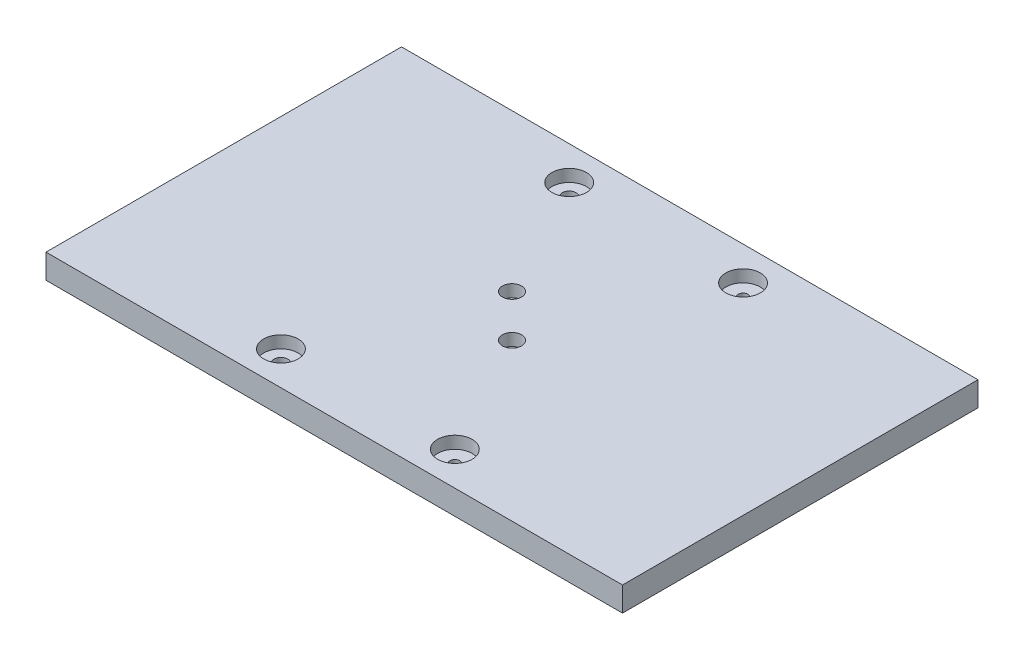
ISO-10303-21;
HEADER;
FILE_DESCRIPTION(('STEP AP214'),'2;1');
FILE_NAME('part.step','',(''),(''),'','','');
FILE_SCHEMA(('AUTOMOTIVE_DESIGN { 1 0 10303 214 1 1 1 1 }'));
ENDSEC;
DATA;
#1=APPLICATION_CONTEXT('core data for automotive mechanical design processes');
#2=APPLICATION_PROTOCOL_DEFINITION('international standard','automotive_design',2000,#1);
#3=PRODUCT_CONTEXT('',#1,'mechanical');
#4=PRODUCT('Part','Part','',(#3));
#5=PRODUCT_RELATED_PRODUCT_CATEGORY('part','',(#4));
#6=PRODUCT_DEFINITION_FORMATION('','',#4);
#7=PRODUCT_DEFINITION_CONTEXT('part definition',#1,'design');
#8=PRODUCT_DEFINITION('design','',#6,#7);
#9=PRODUCT_DEFINITION_SHAPE('','',#8);
#10=(LENGTH_UNIT() NAMED_UNIT(*) SI_UNIT(.MILLI.,.METRE.));
#11=(NAMED_UNIT(*) PLANE_ANGLE_UNIT() SI_UNIT($,.RADIAN.));
#12=(NAMED_UNIT(*) SI_UNIT($,.STERADIAN.) SOLID_ANGLE_UNIT());
#13=UNCERTAINTY_MEASURE_WITH_UNIT(LENGTH_MEASURE(1.E-05),#10,'distance_accuracy_value','');
#14=(GEOMETRIC_REPRESENTATION_CONTEXT(3) GLOBAL_UNCERTAINTY_ASSIGNED_CONTEXT((#13)) GLOBAL_UNIT_ASSIGNED_CONTEXT((#10,
#11,#12)) REPRESENTATION_CONTEXT('',''));
#15=CARTESIAN_POINT('',(0.,0.,0.));
#16=DIRECTION('',(0.,0.,1.));
#17=DIRECTION('',(1.,0.,0.));
#18=AXIS2_PLACEMENT_3D('',#15,#16,#17);
#19=CARTESIAN_POINT('',(0.,12.7,0.));
#20=DIRECTION('',(0.,1.,0.));
#21=DIRECTION('',(0.,0.,1.));
#22=AXIS2_PLACEMENT_3D('',#19,#20,#21);
#23=PLANE('',#22);
#24=CARTESIAN_POINT('',(-45.25,12.7,75.));
#25=DIRECTION('',(0.,1.,0.));
#26=DIRECTION('',(0.,0.,1.));
#27=AXIS2_PLACEMENT_3D('',#24,#25,#26);
#28=CIRCLE('',#27,8.99999999999999);
#29=CARTESIAN_POINT('',(-45.25,12.7,84.));
#30=VERTEX_POINT('',#29);
#31=EDGE_CURVE('E131',#30,#30,#28,.F.);
#32=ORIENTED_EDGE('',*,*,#31,.T.);
#33=EDGE_LOOP('',(#32));
#34=FACE_BOUND('',#33,.T.);
#35=DIRECTION('',(0.,0.,1.));
#36=VECTOR('',#35,1.);
#37=CARTESIAN_POINT('',(-150.,12.7,92.5));
#38=LINE('',#37,#36);
#39=CARTESIAN_POINT('',(-150.,12.7,-92.5));
#40=VERTEX_POINT('',#39);
#41=CARTESIAN_POINT('',(-150.,12.7,92.5));
#42=VERTEX_POINT('',#41);
#43=EDGE_CURVE('E85',#40,#42,#38,.T.);
#44=ORIENTED_EDGE('',*,*,#43,.T.);
#45=DIRECTION('',(1.,0.,0.));
#46=VECTOR('',#45,1.);
#47=CARTESIAN_POINT('',(150.,12.7,92.5));
#48=LINE('',#47,#46);
#49=CARTESIAN_POINT('',(150.,12.7,92.5));
#50=VERTEX_POINT('',#49);
#51=EDGE_CURVE('E80',#42,#50,#48,.T.);
#52=ORIENTED_EDGE('',*,*,#51,.T.);
#53=DIRECTION('',(0.,0.,-1.));
#54=VECTOR('',#53,1.);
#55=CARTESIAN_POINT('',(150.,12.7,92.5));
#56=LINE('',#55,#54);
#57=CARTESIAN_POINT('',(150.,12.7,-92.5));
#58=VERTEX_POINT('',#57);
#59=EDGE_CURVE('E83',#50,#58,#56,.T.);
#60=ORIENTED_EDGE('',*,*,#59,.T.);
#61=DIRECTION('',(-1.,0.,0.));
#62=VECTOR('',#61,1.);
#63=CARTESIAN_POINT('',(150.,12.7,-92.5));
#64=LINE('',#63,#62);
#65=EDGE_CURVE('E50',#58,#40,#64,.T.);
#66=ORIENTED_EDGE('',*,*,#65,.T.);
#67=EDGE_LOOP('',(#44,#52,#60,#66));
#68=FACE_BOUND('',#67,.T.);
#69=CARTESIAN_POINT('',(45.25,12.7,-75.));
#70=DIRECTION('',(0.,1.,0.));
#71=DIRECTION('',(0.,0.,1.));
#72=AXIS2_PLACEMENT_3D('',#69,#70,#71);
#73=CIRCLE('',#72,9.00000000000001);
#74=CARTESIAN_POINT('',(45.25,12.7,-66.));
#75=VERTEX_POINT('',#74);
#76=EDGE_CURVE('E135',#75,#75,#73,.T.);
#77=ORIENTED_EDGE('',*,*,#76,.F.);
#78=EDGE_LOOP('',(#77));
#79=FACE_BOUND('',#78,.T.);
#80=CARTESIAN_POINT('',(-11.,12.7,-11.));
#81=DIRECTION('',(0.,1.,0.));
#82=DIRECTION('',(0.,0.,1.));
#83=AXIS2_PLACEMENT_3D('',#80,#81,#82);
#84=CIRCLE('',#83,5.);
#85=CARTESIAN_POINT('',(-11.,12.7,-6.));
#86=VERTEX_POINT('',#85);
#87=EDGE_CURVE('E146',#86,#86,#84,.T.);
#88=ORIENTED_EDGE('',*,*,#87,.F.);
#89=EDGE_LOOP('',(#88));
#90=FACE_BOUND('',#89,.T.);
#91=CARTESIAN_POINT('',(11.,12.7,11.));
#92=DIRECTION('',(0.,1.,0.));
#93=DIRECTION('',(0.,0.,1.));
#94=AXIS2_PLACEMENT_3D('',#91,#92,#93);
#95=CIRCLE('',#94,5.);
#96=CARTESIAN_POINT('',(11.,12.7,16.));
#97=VERTEX_POINT('',#96);
#98=EDGE_CURVE('E155',#97,#97,#95,.T.);
#99=ORIENTED_EDGE('',*,*,#98,.F.);
#100=EDGE_LOOP('',(#99));
#101=FACE_BOUND('',#100,.T.);
#102=CARTESIAN_POINT('',(-45.25,12.7,-75.));
#103=DIRECTION('',(0.,1.,0.));
#104=DIRECTION('',(0.,0.,1.));
#105=AXIS2_PLACEMENT_3D('',#102,#103,#104);
#106=CIRCLE('',#105,9.00000000000001);
#107=CARTESIAN_POINT('',(-45.25,12.7,-66.));
#108=VERTEX_POINT('',#107);
#109=EDGE_CURVE('E164',#108,#108,#106,.T.);
#110=ORIENTED_EDGE('',*,*,#109,.F.);
#111=EDGE_LOOP('',(#110));
#112=FACE_BOUND('',#111,.T.);
#113=CARTESIAN_POINT('',(45.25,12.7,75.));
#114=DIRECTION('',(0.,-1.,0.));
#115=DIRECTION('',(0.,0.,-1.));
#116=AXIS2_PLACEMENT_3D('',#113,#114,#115);
#117=CIRCLE('',#116,9.00000000000001);
#118=CARTESIAN_POINT('',(45.25,12.7,66.));
#119=VERTEX_POINT('',#118);
#120=EDGE_CURVE('E178',#119,#119,#117,.T.);
#121=ORIENTED_EDGE('',*,*,#120,.T.);
#122=EDGE_LOOP('',(#121));
#123=FACE_BOUND('',#122,.T.);
#124=ADVANCED_FACE('F32',(#34,#68,#79,#90,#101,#112,#123),#23,.T.);
#125=CARTESIAN_POINT('',(-45.25,12.7,-75.));
#126=DIRECTION('',(0.,-1.,0.));
#127=DIRECTION('',(0.,0.,-1.));
#128=AXIS2_PLACEMENT_3D('',#125,#126,#127);
#129=CYLINDRICAL_SURFACE('',#128,3.55999999999999);
#130=CARTESIAN_POINT('',(-45.25,0.,-75.));
#131=DIRECTION('',(0.,1.,0.));
#132=DIRECTION('',(0.,0.,1.));
#133=AXIS2_PLACEMENT_3D('',#130,#131,#132);
#134=CIRCLE('',#133,3.55999999999999);
#135=CARTESIAN_POINT('',(-45.25,0.,-71.44));
#136=VERTEX_POINT('',#135);
#137=EDGE_CURVE('E101',#136,#136,#134,.T.);
#138=ORIENTED_EDGE('',*,*,#137,.F.);
#139=EDGE_LOOP('',(#138));
#140=FACE_BOUND('',#139,.T.);
#141=CARTESIAN_POINT('',(-45.25,6.35,-75.));
#142=DIRECTION('',(0.,1.,0.));
#143=DIRECTION('',(0.,0.,1.));
#144=AXIS2_PLACEMENT_3D('',#141,#142,#143);
#145=CIRCLE('',#144,3.55999999999999);
#146=CARTESIAN_POINT('',(-45.25,6.35,-71.44));
#147=VERTEX_POINT('',#146);
#148=EDGE_CURVE('E167',#147,#147,#145,.F.);
#149=ORIENTED_EDGE('',*,*,#148,.F.);
#150=EDGE_LOOP('',(#149));
#151=FACE_BOUND('',#150,.T.);
#152=ADVANCED_FACE('F206',(#140,#151),#129,.F.);
#153=CARTESIAN_POINT('',(11.,12.7,11.));
#154=DIRECTION('',(0.,-1.,0.));
#155=DIRECTION('',(0.,0.,-1.));
#156=AXIS2_PLACEMENT_3D('',#153,#154,#155);
#157=CYLINDRICAL_SURFACE('',#156,2.5);
#158=CARTESIAN_POINT('',(11.,0.,11.));
#159=DIRECTION('',(0.,1.,0.));
#160=DIRECTION('',(0.,0.,1.));
#161=AXIS2_PLACEMENT_3D('',#158,#159,#160);
#162=CIRCLE('',#161,2.5);
#163=CARTESIAN_POINT('',(11.,0.,13.5));
#164=VERTEX_POINT('',#163);
#165=EDGE_CURVE('E127',#164,#164,#162,.T.);
#166=ORIENTED_EDGE('',*,*,#165,.F.);
#167=EDGE_LOOP('',(#166));
#168=FACE_BOUND('',#167,.T.);
#169=CARTESIAN_POINT('',(11.,6.35,11.));
#170=DIRECTION('',(0.,1.,0.));
#171=DIRECTION('',(0.,0.,1.));
#172=AXIS2_PLACEMENT_3D('',#169,#170,#171);
#173=CIRCLE('',#172,2.5);
#174=CARTESIAN_POINT('',(11.,6.35,13.5));
#175=VERTEX_POINT('',#174);
#176=EDGE_CURVE('E158',#175,#175,#173,.F.);
#177=ORIENTED_EDGE('',*,*,#176,.F.);
#178=EDGE_LOOP('',(#177));
#179=FACE_BOUND('',#178,.T.);
#180=ADVANCED_FACE('F202',(#168,#179),#157,.F.);
#181=CARTESIAN_POINT('',(-11.,12.7,-11.));
#182=DIRECTION('',(0.,-1.,0.));
#183=DIRECTION('',(0.,0.,-1.));
#184=AXIS2_PLACEMENT_3D('',#181,#182,#183);
#185=CYLINDRICAL_SURFACE('',#184,2.5);
#186=CARTESIAN_POINT('',(-11.,0.,-11.));
#187=DIRECTION('',(0.,1.,0.));
#188=DIRECTION('',(0.,0.,1.));
#189=AXIS2_PLACEMENT_3D('',#186,#187,#188);
#190=CIRCLE('',#189,2.5);
#191=CARTESIAN_POINT('',(-11.,0.,-8.5));
#192=VERTEX_POINT('',#191);
#193=EDGE_CURVE('E124',#192,#192,#190,.T.);
#194=ORIENTED_EDGE('',*,*,#193,.F.);
#195=EDGE_LOOP('',(#194));
#196=FACE_BOUND('',#195,.T.);
#197=CARTESIAN_POINT('',(-11.,6.35,-11.));
#198=DIRECTION('',(0.,1.,0.));
#199=DIRECTION('',(0.,0.,1.));
#200=AXIS2_PLACEMENT_3D('',#197,#198,#199);
#201=CIRCLE('',#200,2.5);
#202=CARTESIAN_POINT('',(-11.,6.35,-8.5));
#203=VERTEX_POINT('',#202);
#204=EDGE_CURVE('E149',#203,#203,#201,.F.);
#205=ORIENTED_EDGE('',*,*,#204,.F.);
#206=EDGE_LOOP('',(#205));
#207=FACE_BOUND('',#206,.T.);
#208=ADVANCED_FACE('F205',(#196,#207),#185,.F.);
#209=CARTESIAN_POINT('',(45.25,12.7,-75.));
#210=DIRECTION('',(0.,-1.,0.));
#211=DIRECTION('',(0.,0.,-1.));
#212=AXIS2_PLACEMENT_3D('',#209,#210,#211);
#213=CYLINDRICAL_SURFACE('',#212,2.5);
#214=CARTESIAN_POINT('',(45.25,0.,-75.));
#215=DIRECTION('',(0.,1.,0.));
#216=DIRECTION('',(0.,0.,1.));
#217=AXIS2_PLACEMENT_3D('',#214,#215,#216);
#218=CIRCLE('',#217,2.5);
#219=CARTESIAN_POINT('',(45.25,0.,-72.5));
#220=VERTEX_POINT('',#219);
#221=EDGE_CURVE('E118',#220,#220,#218,.T.);
#222=ORIENTED_EDGE('',*,*,#221,.F.);
#223=EDGE_LOOP('',(#222));
#224=FACE_BOUND('',#223,.T.);
#225=CARTESIAN_POINT('',(45.25,6.35,-75.));
#226=DIRECTION('',(0.,1.,0.));
#227=DIRECTION('',(0.,0.,1.));
#228=AXIS2_PLACEMENT_3D('',#225,#226,#227);
#229=CIRCLE('',#228,2.5);
#230=CARTESIAN_POINT('',(45.25,6.35,-72.5));
#231=VERTEX_POINT('',#230);
#232=EDGE_CURVE('E140',#231,#231,#229,.F.);
#233=ORIENTED_EDGE('',*,*,#232,.F.);
#234=EDGE_LOOP('',(#233));
#235=FACE_BOUND('',#234,.T.);
#236=ADVANCED_FACE('F267',(#224,#235),#213,.F.);
#237=CARTESIAN_POINT('',(-45.25,12.7,75.));
#238=DIRECTION('',(0.,-1.,0.));
#239=DIRECTION('',(0.,0.,-1.));
#240=AXIS2_PLACEMENT_3D('',#237,#238,#239);
#241=CYLINDRICAL_SURFACE('',#240,3.56000000000001);
#242=CARTESIAN_POINT('',(-45.25,0.,75.));
#243=DIRECTION('',(0.,1.,0.));
#244=DIRECTION('',(0.,0.,1.));
#245=AXIS2_PLACEMENT_3D('',#242,#243,#244);
#246=CIRCLE('',#245,3.56000000000001);
#247=CARTESIAN_POINT('',(-45.25,0.,78.56));
#248=VERTEX_POINT('',#247);
#249=EDGE_CURVE('E115',#248,#248,#246,.T.);
#250=ORIENTED_EDGE('',*,*,#249,.F.);
#251=EDGE_LOOP('',(#250));
#252=FACE_BOUND('',#251,.T.);
#253=CARTESIAN_POINT('',(-45.25,6.35,75.));
#254=DIRECTION('',(0.,1.,0.));
#255=DIRECTION('',(0.,0.,1.));
#256=AXIS2_PLACEMENT_3D('',#253,#254,#255);
#257=CIRCLE('',#256,3.56000000000001);
#258=CARTESIAN_POINT('',(-45.25,6.35,78.56));
#259=VERTEX_POINT('',#258);
#260=EDGE_CURVE('E130',#259,#259,#257,.F.);
#261=ORIENTED_EDGE('',*,*,#260,.F.);
#262=EDGE_LOOP('',(#261));
#263=FACE_BOUND('',#262,.T.);
#264=ADVANCED_FACE('F197',(#252,#263),#241,.F.);
#265=CARTESIAN_POINT('',(0.,0.,0.));
#266=DIRECTION('',(0.,1.,0.));
#267=DIRECTION('',(0.,0.,1.));
#268=AXIS2_PLACEMENT_3D('',#265,#266,#267);
#269=PLANE('',#268);
#270=ORIENTED_EDGE('',*,*,#193,.T.);
#271=EDGE_LOOP('',(#270));
#272=FACE_BOUND('',#271,.T.);
#273=ORIENTED_EDGE('',*,*,#221,.T.);
#274=EDGE_LOOP('',(#273));
#275=FACE_BOUND('',#274,.T.);
#276=ORIENTED_EDGE('',*,*,#137,.T.);
#277=EDGE_LOOP('',(#276));
#278=FACE_BOUND('',#277,.T.);
#279=DIRECTION('',(0.,0.,1.));
#280=VECTOR('',#279,1.);
#281=CARTESIAN_POINT('',(-150.,0.,92.5));
#282=LINE('',#281,#280);
#283=CARTESIAN_POINT('',(-150.,0.,-92.5));
#284=VERTEX_POINT('',#283);
#285=CARTESIAN_POINT('',(-150.,0.,92.5));
#286=VERTEX_POINT('',#285);
#287=EDGE_CURVE('E98',#284,#286,#282,.T.);
#288=ORIENTED_EDGE('',*,*,#287,.F.);
#289=DIRECTION('',(-1.,0.,0.));
#290=VECTOR('',#289,1.);
#291=CARTESIAN_POINT('',(150.,0.,-92.5));
#292=LINE('',#291,#290);
#293=CARTESIAN_POINT('',(150.,0.,-92.5));
#294=VERTEX_POINT('',#293);
#295=EDGE_CURVE('E73',#294,#284,#292,.T.);
#296=ORIENTED_EDGE('',*,*,#295,.F.);
#297=DIRECTION('',(0.,0.,-1.));
#298=VECTOR('',#297,1.);
#299=CARTESIAN_POINT('',(150.,0.,92.5));
#300=LINE('',#299,#298);
#301=CARTESIAN_POINT('',(150.,0.,92.5));
#302=VERTEX_POINT('',#301);
#303=EDGE_CURVE('E67',#302,#294,#300,.T.);
#304=ORIENTED_EDGE('',*,*,#303,.F.);
#305=DIRECTION('',(1.,0.,0.));
#306=VECTOR('',#305,1.);
#307=CARTESIAN_POINT('',(150.,0.,92.5));
#308=LINE('',#307,#306);
#309=EDGE_CURVE('E89',#286,#302,#308,.T.);
#310=ORIENTED_EDGE('',*,*,#309,.F.);
#311=EDGE_LOOP('',(#288,#296,#304,#310));
#312=FACE_BOUND('',#311,.T.);
#313=ORIENTED_EDGE('',*,*,#249,.T.);
#314=EDGE_LOOP('',(#313));
#315=FACE_BOUND('',#314,.T.);
#316=CARTESIAN_POINT('',(45.25,0.,75.));
#317=DIRECTION('',(0.,1.,0.));
#318=DIRECTION('',(0.,0.,1.));
#319=AXIS2_PLACEMENT_3D('',#316,#317,#318);
#320=CIRCLE('',#319,2.5);
#321=CARTESIAN_POINT('',(45.25,0.,77.5));
#322=VERTEX_POINT('',#321);
#323=EDGE_CURVE('E121',#322,#322,#320,.T.);
#324=ORIENTED_EDGE('',*,*,#323,.T.);
#325=EDGE_LOOP('',(#324));
#326=FACE_BOUND('',#325,.T.);
#327=ORIENTED_EDGE('',*,*,#165,.T.);
#328=EDGE_LOOP('',(#327));
#329=FACE_BOUND('',#328,.T.);
#330=ADVANCED_FACE('F109',(#272,#275,#278,#312,#315,#326,#329),#269,.F.);
#331=CARTESIAN_POINT('',(-150.,12.7,92.5));
#332=DIRECTION('',(1.,0.,0.));
#333=DIRECTION('',(0.,0.,-1.));
#334=AXIS2_PLACEMENT_3D('',#331,#332,#333);
#335=PLANE('',#334);
#336=ORIENTED_EDGE('',*,*,#287,.T.);
#337=DIRECTION('',(0.,-1.,0.));
#338=VECTOR('',#337,1.);
#339=CARTESIAN_POINT('',(-150.,12.7,92.5));
#340=LINE('',#339,#338);
#341=EDGE_CURVE('E11',#42,#286,#340,.T.);
#342=ORIENTED_EDGE('',*,*,#341,.F.);
#343=ORIENTED_EDGE('',*,*,#43,.F.);
#344=DIRECTION('',(0.,-1.,0.));
#345=VECTOR('',#344,1.);
#346=CARTESIAN_POINT('',(-150.,12.7,-92.5));
#347=LINE('',#346,#345);
#348=EDGE_CURVE('E94',#40,#284,#347,.T.);
#349=ORIENTED_EDGE('',*,*,#348,.T.);
#350=EDGE_LOOP('',(#336,#342,#343,#349));
#351=FACE_BOUND('',#350,.T.);
#352=ADVANCED_FACE('F34',(#351),#335,.F.);
#353=CARTESIAN_POINT('',(150.,12.7,92.5));
#354=DIRECTION('',(0.,0.,-1.));
#355=DIRECTION('',(-1.,0.,0.));
#356=AXIS2_PLACEMENT_3D('',#353,#354,#355);
#357=PLANE('',#356);
#358=ORIENTED_EDGE('',*,*,#309,.T.);
#359=DIRECTION('',(0.,-1.,0.));
#360=VECTOR('',#359,1.);
#361=CARTESIAN_POINT('',(150.,12.7,92.5));
#362=LINE('',#361,#360);
#363=EDGE_CURVE('E42',#50,#302,#362,.T.);
#364=ORIENTED_EDGE('',*,*,#363,.F.);
#365=ORIENTED_EDGE('',*,*,#51,.F.);
#366=ORIENTED_EDGE('',*,*,#341,.T.);
#367=EDGE_LOOP('',(#358,#364,#365,#366));
#368=FACE_BOUND('',#367,.T.);
#369=ADVANCED_FACE('F88',(#368),#357,.F.);
#370=CARTESIAN_POINT('',(150.,12.7,92.5));
#371=DIRECTION('',(-1.,0.,0.));
#372=DIRECTION('',(0.,0.,1.));
#373=AXIS2_PLACEMENT_3D('',#370,#371,#372);
#374=PLANE('',#373);
#375=ORIENTED_EDGE('',*,*,#303,.T.);
#376=DIRECTION('',(0.,-1.,0.));
#377=VECTOR('',#376,1.);
#378=CARTESIAN_POINT('',(150.,12.7,-92.5));
#379=LINE('',#378,#377);
#380=EDGE_CURVE('E90',#58,#294,#379,.T.);
#381=ORIENTED_EDGE('',*,*,#380,.F.);
#382=ORIENTED_EDGE('',*,*,#59,.F.);
#383=ORIENTED_EDGE('',*,*,#363,.T.);
#384=EDGE_LOOP('',(#375,#381,#382,#383));
#385=FACE_BOUND('',#384,.T.);
#386=ADVANCED_FACE('F92',(#385),#374,.F.);
#387=CARTESIAN_POINT('',(150.,12.7,-92.5));
#388=DIRECTION('',(0.,0.,1.));
#389=DIRECTION('',(1.,0.,0.));
#390=AXIS2_PLACEMENT_3D('',#387,#388,#389);
#391=PLANE('',#390);
#392=ORIENTED_EDGE('',*,*,#295,.T.);
#393=ORIENTED_EDGE('',*,*,#348,.F.);
#394=ORIENTED_EDGE('',*,*,#65,.F.);
#395=ORIENTED_EDGE('',*,*,#380,.T.);
#396=EDGE_LOOP('',(#392,#393,#394,#395));
#397=FACE_BOUND('',#396,.T.);
#398=ADVANCED_FACE('F106',(#397),#391,.F.);
#399=CARTESIAN_POINT('',(45.25,12.7,75.));
#400=DIRECTION('',(0.,-1.,0.));
#401=DIRECTION('',(0.,0.,-1.));
#402=AXIS2_PLACEMENT_3D('',#399,#400,#401);
#403=CYLINDRICAL_SURFACE('',#402,2.5);
#404=CARTESIAN_POINT('',(45.25,6.35,75.));
#405=DIRECTION('',(0.,-1.,0.));
#406=DIRECTION('',(0.,0.,-1.));
#407=AXIS2_PLACEMENT_3D('',#404,#405,#406);
#408=CIRCLE('',#407,2.5);
#409=CARTESIAN_POINT('',(45.25,6.35,72.5));
#410=VERTEX_POINT('',#409);
#411=EDGE_CURVE('E36',#410,#410,#408,.T.);
#412=ORIENTED_EDGE('',*,*,#411,.F.);
#413=EDGE_LOOP('',(#412));
#414=FACE_BOUND('',#413,.T.);
#415=ORIENTED_EDGE('',*,*,#323,.F.);
#416=EDGE_LOOP('',(#415));
#417=FACE_BOUND('',#416,.T.);
#418=ADVANCED_FACE('F188',(#414,#417),#403,.F.);
#419=CARTESIAN_POINT('',(-45.25,6.35,75.));
#420=DIRECTION('',(0.,1.,0.));
#421=DIRECTION('',(0.,0.,1.));
#422=AXIS2_PLACEMENT_3D('',#419,#420,#421);
#423=CYLINDRICAL_SURFACE('',#422,8.99999999999999);
#424=CARTESIAN_POINT('',(-45.25,6.35,75.));
#425=DIRECTION('',(0.,1.,0.));
#426=DIRECTION('',(0.,0.,1.));
#427=AXIS2_PLACEMENT_3D('',#424,#425,#426);
#428=CIRCLE('',#427,8.99999999999999);
#429=CARTESIAN_POINT('',(-45.25,6.35,84.));
#430=VERTEX_POINT('',#429);
#431=EDGE_CURVE('E134',#430,#430,#428,.F.);
#432=ORIENTED_EDGE('',*,*,#431,.T.);
#433=EDGE_LOOP('',(#432));
#434=FACE_BOUND('',#433,.T.);
#435=ORIENTED_EDGE('',*,*,#31,.F.);
#436=EDGE_LOOP('',(#435));
#437=FACE_BOUND('',#436,.T.);
#438=ADVANCED_FACE('F191',(#434,#437),#423,.F.);
#439=CARTESIAN_POINT('',(0.,6.35,0.));
#440=DIRECTION('',(0.,1.,0.));
#441=DIRECTION('',(0.,0.,1.));
#442=AXIS2_PLACEMENT_3D('',#439,#440,#441);
#443=PLANE('',#442);
#444=ORIENTED_EDGE('',*,*,#431,.F.);
#445=EDGE_LOOP('',(#444));
#446=FACE_BOUND('',#445,.T.);
#447=ORIENTED_EDGE('',*,*,#260,.T.);
#448=EDGE_LOOP('',(#447));
#449=FACE_BOUND('',#448,.T.);
#450=ADVANCED_FACE('F255',(#446,#449),#443,.T.);
#451=CARTESIAN_POINT('',(45.25,6.35,-75.));
#452=DIRECTION('',(0.,1.,0.));
#453=DIRECTION('',(0.,0.,1.));
#454=AXIS2_PLACEMENT_3D('',#451,#452,#453);
#455=CYLINDRICAL_SURFACE('',#454,9.00000000000001);
#456=CARTESIAN_POINT('',(45.25,6.35,-75.));
#457=DIRECTION('',(0.,1.,0.));
#458=DIRECTION('',(0.,0.,1.));
#459=AXIS2_PLACEMENT_3D('',#456,#457,#458);
#460=CIRCLE('',#459,9.00000000000001);
#461=CARTESIAN_POINT('',(45.25,6.35,-66.));
#462=VERTEX_POINT('',#461);
#463=EDGE_CURVE('E143',#462,#462,#460,.T.);
#464=ORIENTED_EDGE('',*,*,#463,.F.);
#465=EDGE_LOOP('',(#464));
#466=FACE_BOUND('',#465,.T.);
#467=ORIENTED_EDGE('',*,*,#76,.T.);
#468=EDGE_LOOP('',(#467));
#469=FACE_BOUND('',#468,.T.);
#470=ADVANCED_FACE('F252',(#466,#469),#455,.F.);
#471=CARTESIAN_POINT('',(0.,6.35,0.));
#472=DIRECTION('',(0.,1.,0.));
#473=DIRECTION('',(0.,0.,1.));
#474=AXIS2_PLACEMENT_3D('',#471,#472,#473);
#475=PLANE('',#474);
#476=ORIENTED_EDGE('',*,*,#232,.T.);
#477=EDGE_LOOP('',(#476));
#478=FACE_BOUND('',#477,.T.);
#479=ORIENTED_EDGE('',*,*,#463,.T.);
#480=EDGE_LOOP('',(#479));
#481=FACE_BOUND('',#480,.T.);
#482=ADVANCED_FACE('F247',(#478,#481),#475,.T.);
#483=CARTESIAN_POINT('',(-11.,6.35,-11.));
#484=DIRECTION('',(0.,1.,0.));
#485=DIRECTION('',(0.,0.,1.));
#486=AXIS2_PLACEMENT_3D('',#483,#484,#485);
#487=CYLINDRICAL_SURFACE('',#486,5.);
#488=CARTESIAN_POINT('',(-11.,6.35,-11.));
#489=DIRECTION('',(0.,1.,0.));
#490=DIRECTION('',(0.,0.,1.));
#491=AXIS2_PLACEMENT_3D('',#488,#489,#490);
#492=CIRCLE('',#491,5.);
#493=CARTESIAN_POINT('',(-11.,6.35,-6.));
#494=VERTEX_POINT('',#493);
#495=EDGE_CURVE('E152',#494,#494,#492,.T.);
#496=ORIENTED_EDGE('',*,*,#495,.F.);
#497=EDGE_LOOP('',(#496));
#498=FACE_BOUND('',#497,.T.);
#499=ORIENTED_EDGE('',*,*,#87,.T.);
#500=EDGE_LOOP('',(#499));
#501=FACE_BOUND('',#500,.T.);
#502=ADVANCED_FACE('F244',(#498,#501),#487,.F.);
#503=CARTESIAN_POINT('',(0.,6.35,0.));
#504=DIRECTION('',(0.,1.,0.));
#505=DIRECTION('',(0.,0.,1.));
#506=AXIS2_PLACEMENT_3D('',#503,#504,#505);
#507=PLANE('',#506);
#508=ORIENTED_EDGE('',*,*,#204,.T.);
#509=EDGE_LOOP('',(#508));
#510=FACE_BOUND('',#509,.T.);
#511=ORIENTED_EDGE('',*,*,#495,.T.);
#512=EDGE_LOOP('',(#511));
#513=FACE_BOUND('',#512,.T.);
#514=ADVANCED_FACE('F220',(#510,#513),#507,.T.);
#515=CARTESIAN_POINT('',(11.,6.35,11.));
#516=DIRECTION('',(0.,1.,0.));
#517=DIRECTION('',(0.,0.,1.));
#518=AXIS2_PLACEMENT_3D('',#515,#516,#517);
#519=CYLINDRICAL_SURFACE('',#518,5.);
#520=CARTESIAN_POINT('',(11.,6.35,11.));
#521=DIRECTION('',(0.,1.,0.));
#522=DIRECTION('',(0.,0.,1.));
#523=AXIS2_PLACEMENT_3D('',#520,#521,#522);
#524=CIRCLE('',#523,5.);
#525=CARTESIAN_POINT('',(11.,6.35,16.));
#526=VERTEX_POINT('',#525);
#527=EDGE_CURVE('E161',#526,#526,#524,.T.);
#528=ORIENTED_EDGE('',*,*,#527,.F.);
#529=EDGE_LOOP('',(#528));
#530=FACE_BOUND('',#529,.T.);
#531=ORIENTED_EDGE('',*,*,#98,.T.);
#532=EDGE_LOOP('',(#531));
#533=FACE_BOUND('',#532,.T.);
#534=ADVANCED_FACE('F214',(#530,#533),#519,.F.);
#535=CARTESIAN_POINT('',(0.,6.35,0.));
#536=DIRECTION('',(0.,1.,0.));
#537=DIRECTION('',(0.,0.,1.));
#538=AXIS2_PLACEMENT_3D('',#535,#536,#537);
#539=PLANE('',#538);
#540=ORIENTED_EDGE('',*,*,#176,.T.);
#541=EDGE_LOOP('',(#540));
#542=FACE_BOUND('',#541,.T.);
#543=ORIENTED_EDGE('',*,*,#527,.T.);
#544=EDGE_LOOP('',(#543));
#545=FACE_BOUND('',#544,.T.);
#546=ADVANCED_FACE('F210',(#542,#545),#539,.T.);
#547=CARTESIAN_POINT('',(-45.25,6.35,-75.));
#548=DIRECTION('',(0.,1.,0.));
#549=DIRECTION('',(0.,0.,1.));
#550=AXIS2_PLACEMENT_3D('',#547,#548,#549);
#551=CYLINDRICAL_SURFACE('',#550,9.00000000000001);
#552=CARTESIAN_POINT('',(-45.25,6.35,-75.));
#553=DIRECTION('',(0.,1.,0.));
#554=DIRECTION('',(0.,0.,1.));
#555=AXIS2_PLACEMENT_3D('',#552,#553,#554);
#556=CIRCLE('',#555,9.00000000000001);
#557=CARTESIAN_POINT('',(-45.25,6.35,-66.));
#558=VERTEX_POINT('',#557);
#559=EDGE_CURVE('E170',#558,#558,#556,.T.);
#560=ORIENTED_EDGE('',*,*,#559,.F.);
#561=EDGE_LOOP('',(#560));
#562=FACE_BOUND('',#561,.T.);
#563=ORIENTED_EDGE('',*,*,#109,.T.);
#564=EDGE_LOOP('',(#563));
#565=FACE_BOUND('',#564,.T.);
#566=ADVANCED_FACE('F213',(#562,#565),#551,.F.);
#567=CARTESIAN_POINT('',(0.,6.35,0.));
#568=DIRECTION('',(0.,1.,0.));
#569=DIRECTION('',(0.,0.,1.));
#570=AXIS2_PLACEMENT_3D('',#567,#568,#569);
#571=PLANE('',#570);
#572=ORIENTED_EDGE('',*,*,#148,.T.);
#573=EDGE_LOOP('',(#572));
#574=FACE_BOUND('',#573,.T.);
#575=ORIENTED_EDGE('',*,*,#559,.T.);
#576=EDGE_LOOP('',(#575));
#577=FACE_BOUND('',#576,.T.);
#578=ADVANCED_FACE('F231',(#574,#577),#571,.T.);
#579=CARTESIAN_POINT('',(45.25,6.35,75.));
#580=DIRECTION('',(0.,1.,0.));
#581=DIRECTION('',(0.,0.,1.));
#582=AXIS2_PLACEMENT_3D('',#579,#580,#581);
#583=CYLINDRICAL_SURFACE('',#582,9.00000000000001);
#584=CARTESIAN_POINT('',(45.25,6.35,75.));
#585=DIRECTION('',(0.,-1.,0.));
#586=DIRECTION('',(0.,0.,-1.));
#587=AXIS2_PLACEMENT_3D('',#584,#585,#586);
#588=CIRCLE('',#587,9.00000000000001);
#589=CARTESIAN_POINT('',(45.25,6.35,66.));
#590=VERTEX_POINT('',#589);
#591=EDGE_CURVE('E175',#590,#590,#588,.T.);
#592=ORIENTED_EDGE('',*,*,#591,.T.);
#593=EDGE_LOOP('',(#592));
#594=FACE_BOUND('',#593,.T.);
#595=ORIENTED_EDGE('',*,*,#120,.F.);
#596=EDGE_LOOP('',(#595));
#597=FACE_BOUND('',#596,.T.);
#598=ADVANCED_FACE('F237',(#594,#597),#583,.F.);
#599=CARTESIAN_POINT('',(45.25,6.35,75.));
#600=DIRECTION('',(0.,-1.,0.));
#601=DIRECTION('',(0.,0.,-1.));
#602=AXIS2_PLACEMENT_3D('',#599,#600,#601);
#603=PLANE('',#602);
#604=ORIENTED_EDGE('',*,*,#411,.T.);
#605=EDGE_LOOP('',(#604));
#606=FACE_BOUND('',#605,.T.);
#607=ORIENTED_EDGE('',*,*,#591,.F.);
#608=EDGE_LOOP('',(#607));
#609=FACE_BOUND('',#608,.T.);
#610=ADVANCED_FACE('F185',(#606,#609),#603,.F.);
#611=CLOSED_SHELL('',(#124,#152,#180,#208,#236,#264,#330,#352,#369,#386,#398,#418,#438,#450,
#470,#482,#502,#514,#534,#546,#566,#578,#598,#610));
#612=MANIFOLD_SOLID_BREP('B2',#611);
#613=ADVANCED_BREP_SHAPE_REPRESENTATION('',(#18,#612),#14);
#614=SHAPE_DEFINITION_REPRESENTATION(#9,#613);
ENDSEC;
END-ISO-10303-21;
